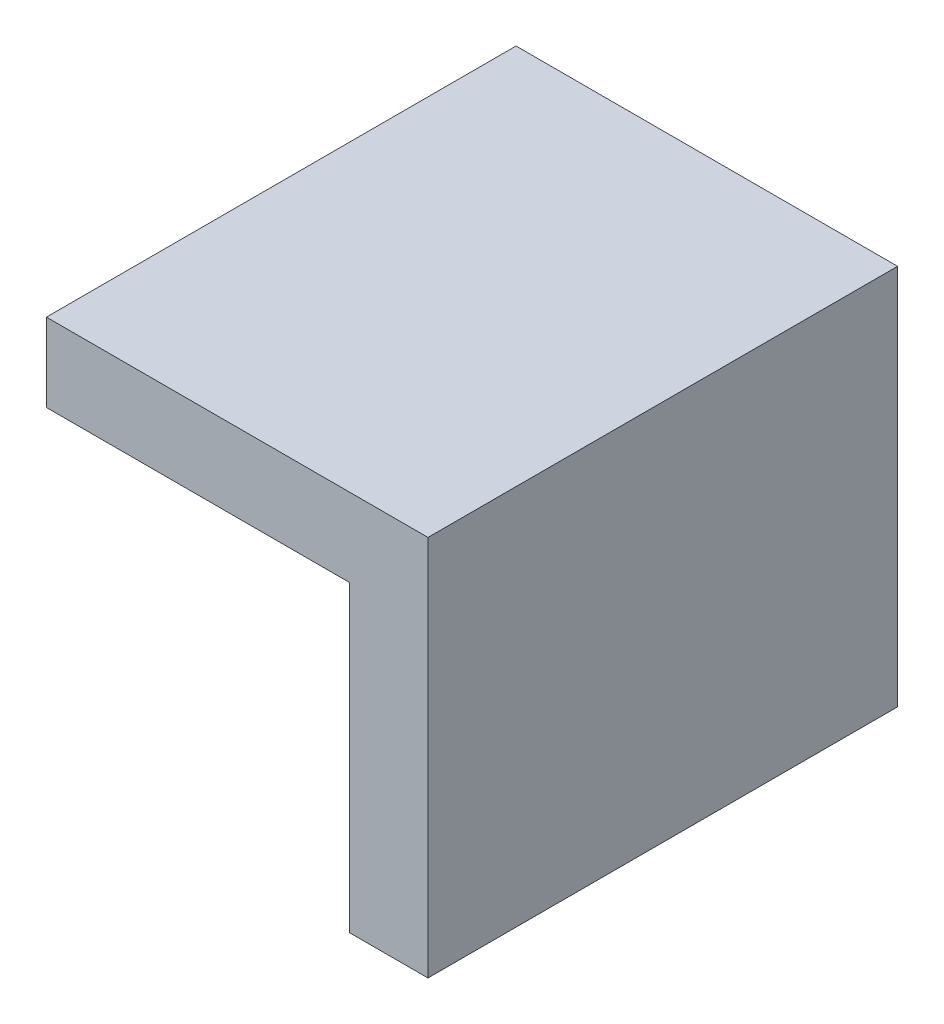
ISO-10303-21;
HEADER;
FILE_DESCRIPTION(('STEP AP214'),'2;1');
FILE_NAME('part.step','',(''),(''),'','','');
FILE_SCHEMA(('AUTOMOTIVE_DESIGN { 1 0 10303 214 1 1 1 1 }'));
ENDSEC;
DATA;
#1=APPLICATION_CONTEXT('core data for automotive mechanical design processes');
#2=APPLICATION_PROTOCOL_DEFINITION('international standard','automotive_design',2000,#1);
#3=PRODUCT_CONTEXT('',#1,'mechanical');
#4=PRODUCT('Part','Part','',(#3));
#5=PRODUCT_RELATED_PRODUCT_CATEGORY('part','',(#4));
#6=PRODUCT_DEFINITION_FORMATION('','',#4);
#7=PRODUCT_DEFINITION_CONTEXT('part definition',#1,'design');
#8=PRODUCT_DEFINITION('design','',#6,#7);
#9=PRODUCT_DEFINITION_SHAPE('','',#8);
#10=(LENGTH_UNIT() NAMED_UNIT(*) SI_UNIT(.MILLI.,.METRE.));
#11=(NAMED_UNIT(*) PLANE_ANGLE_UNIT() SI_UNIT($,.RADIAN.));
#12=(NAMED_UNIT(*) SI_UNIT($,.STERADIAN.) SOLID_ANGLE_UNIT());
#13=UNCERTAINTY_MEASURE_WITH_UNIT(LENGTH_MEASURE(1.E-05),#10,'distance_accuracy_value','');
#14=(GEOMETRIC_REPRESENTATION_CONTEXT(3) GLOBAL_UNCERTAINTY_ASSIGNED_CONTEXT((#13)) GLOBAL_UNIT_ASSIGNED_CONTEXT((#10,
#11,#12)) REPRESENTATION_CONTEXT('',''));
#15=CARTESIAN_POINT('',(0.,0.,0.));
#16=DIRECTION('',(0.,0.,1.));
#17=DIRECTION('',(1.,0.,0.));
#18=AXIS2_PLACEMENT_3D('',#15,#16,#17);
#19=CARTESIAN_POINT('',(3.9,-3.9,9.6));
#20=DIRECTION('',(-1.,0.,0.));
#21=DIRECTION('',(0.,0.,1.));
#22=AXIS2_PLACEMENT_3D('',#19,#20,#21);
#23=PLANE('',#22);
#24=DIRECTION('',(0.,1.,0.));
#25=VECTOR('',#24,1.);
#26=CARTESIAN_POINT('',(3.9,-3.9,0.));
#27=LINE('',#26,#25);
#28=CARTESIAN_POINT('',(3.9,-3.9,0.));
#29=VERTEX_POINT('',#28);
#30=CARTESIAN_POINT('',(3.9,3.9,0.));
#31=VERTEX_POINT('',#30);
#32=EDGE_CURVE('E133',#29,#31,#27,.T.);
#33=ORIENTED_EDGE('',*,*,#32,.T.);
#34=DIRECTION('',(0.,0.,-1.));
#35=VECTOR('',#34,1.);
#36=CARTESIAN_POINT('',(3.9,3.9,9.6));
#37=LINE('',#36,#35);
#38=CARTESIAN_POINT('',(3.9,3.9,9.6));
#39=VERTEX_POINT('',#38);
#40=EDGE_CURVE('E11',#39,#31,#37,.T.);
#41=ORIENTED_EDGE('',*,*,#40,.F.);
#42=DIRECTION('',(0.,1.,0.));
#43=VECTOR('',#42,1.);
#44=CARTESIAN_POINT('',(3.9,-3.9,9.6));
#45=LINE('',#44,#43);
#46=CARTESIAN_POINT('',(3.9,-3.9,9.6));
#47=VERTEX_POINT('',#46);
#48=EDGE_CURVE('E129',#47,#39,#45,.T.);
#49=ORIENTED_EDGE('',*,*,#48,.F.);
#50=DIRECTION('',(0.,0.,-1.));
#51=VECTOR('',#50,1.);
#52=CARTESIAN_POINT('',(3.9,-3.9,9.6));
#53=LINE('',#52,#51);
#54=EDGE_CURVE('E124',#47,#29,#53,.T.);
#55=ORIENTED_EDGE('',*,*,#54,.T.);
#56=EDGE_LOOP('',(#33,#41,#49,#55));
#57=FACE_BOUND('',#56,.T.);
#58=ADVANCED_FACE('F35',(#57),#23,.F.);
#59=CARTESIAN_POINT('',(-3.9,3.9,9.6));
#60=DIRECTION('',(0.,-1.,0.));
#61=DIRECTION('',(0.,0.,-1.));
#62=AXIS2_PLACEMENT_3D('',#59,#60,#61);
#63=PLANE('',#62);
#64=DIRECTION('',(-1.,0.,0.));
#65=VECTOR('',#64,1.);
#66=CARTESIAN_POINT('',(-3.9,3.9,0.));
#67=LINE('',#66,#65);
#68=CARTESIAN_POINT('',(-3.9,3.9,0.));
#69=VERTEX_POINT('',#68);
#70=EDGE_CURVE('E131',#31,#69,#67,.T.);
#71=ORIENTED_EDGE('',*,*,#70,.T.);
#72=DIRECTION('',(0.,0.,-1.));
#73=VECTOR('',#72,1.);
#74=CARTESIAN_POINT('',(-3.9,3.9,9.6));
#75=LINE('',#74,#73);
#76=CARTESIAN_POINT('',(-3.9,3.9,9.6));
#77=VERTEX_POINT('',#76);
#78=EDGE_CURVE('E42',#77,#69,#75,.T.);
#79=ORIENTED_EDGE('',*,*,#78,.F.);
#80=DIRECTION('',(-1.,0.,0.));
#81=VECTOR('',#80,1.);
#82=CARTESIAN_POINT('',(-3.9,3.9,9.6));
#83=LINE('',#82,#81);
#84=EDGE_CURVE('E82',#39,#77,#83,.T.);
#85=ORIENTED_EDGE('',*,*,#84,.F.);
#86=ORIENTED_EDGE('',*,*,#40,.T.);
#87=EDGE_LOOP('',(#71,#79,#85,#86));
#88=FACE_BOUND('',#87,.T.);
#89=ADVANCED_FACE('F179',(#88),#63,.F.);
#90=CARTESIAN_POINT('',(-3.9,-3.9,9.6));
#91=DIRECTION('',(1.,0.,0.));
#92=DIRECTION('',(0.,0.,-1.));
#93=AXIS2_PLACEMENT_3D('',#90,#91,#92);
#94=PLANE('',#93);
#95=DIRECTION('',(0.,-1.,0.));
#96=VECTOR('',#95,1.);
#97=CARTESIAN_POINT('',(-3.9,-3.9,2.));
#98=LINE('',#97,#96);
#99=CARTESIAN_POINT('',(-3.9,2.3,2.));
#100=VERTEX_POINT('',#99);
#101=CARTESIAN_POINT('',(-3.9,-3.9,2.));
#102=VERTEX_POINT('',#101);
#103=EDGE_CURVE('E103',#100,#102,#98,.T.);
#104=ORIENTED_EDGE('',*,*,#103,.F.);
#105=DIRECTION('',(0.,0.,1.));
#106=VECTOR('',#105,1.);
#107=CARTESIAN_POINT('',(-3.9,2.3,2.));
#108=LINE('',#107,#106);
#109=CARTESIAN_POINT('',(-3.9,2.3,9.6));
#110=VERTEX_POINT('',#109);
#111=EDGE_CURVE('E136',#100,#110,#108,.T.);
#112=ORIENTED_EDGE('',*,*,#111,.T.);
#113=DIRECTION('',(0.,-1.,0.));
#114=VECTOR('',#113,1.);
#115=CARTESIAN_POINT('',(-3.9,-3.9,9.6));
#116=LINE('',#115,#114);
#117=EDGE_CURVE('E138',#77,#110,#116,.T.);
#118=ORIENTED_EDGE('',*,*,#117,.F.);
#119=ORIENTED_EDGE('',*,*,#78,.T.);
#120=DIRECTION('',(0.,-1.,0.));
#121=VECTOR('',#120,1.);
#122=CARTESIAN_POINT('',(-3.9,-3.9,0.));
#123=LINE('',#122,#121);
#124=CARTESIAN_POINT('',(-3.9,-3.9,0.));
#125=VERTEX_POINT('',#124);
#126=EDGE_CURVE('E123',#69,#125,#123,.T.);
#127=ORIENTED_EDGE('',*,*,#126,.T.);
#128=DIRECTION('',(0.,0.,-1.));
#129=VECTOR('',#128,1.);
#130=CARTESIAN_POINT('',(-3.9,-3.9,9.6));
#131=LINE('',#130,#129);
#132=EDGE_CURVE('E116',#102,#125,#131,.T.);
#133=ORIENTED_EDGE('',*,*,#132,.F.);
#134=EDGE_LOOP('',(#104,#112,#118,#119,#127,#133));
#135=FACE_BOUND('',#134,.T.);
#136=ADVANCED_FACE('F120',(#135),#94,.F.);
#137=CARTESIAN_POINT('',(-3.9,-3.9,9.6));
#138=DIRECTION('',(0.,1.,0.));
#139=DIRECTION('',(0.,0.,1.));
#140=AXIS2_PLACEMENT_3D('',#137,#138,#139);
#141=PLANE('',#140);
#142=DIRECTION('',(1.,0.,0.));
#143=VECTOR('',#142,1.);
#144=CARTESIAN_POINT('',(-3.9,-3.9,9.6));
#145=LINE('',#144,#143);
#146=CARTESIAN_POINT('',(2.3,-3.9,9.6));
#147=VERTEX_POINT('',#146);
#148=EDGE_CURVE('E57',#147,#47,#145,.T.);
#149=ORIENTED_EDGE('',*,*,#148,.F.);
#150=DIRECTION('',(0.,0.,1.));
#151=VECTOR('',#150,1.);
#152=CARTESIAN_POINT('',(2.3,-3.9,2.));
#153=LINE('',#152,#151);
#154=CARTESIAN_POINT('',(2.3,-3.9,2.));
#155=VERTEX_POINT('',#154);
#156=EDGE_CURVE('E49',#155,#147,#153,.T.);
#157=ORIENTED_EDGE('',*,*,#156,.F.);
#158=DIRECTION('',(1.,0.,0.));
#159=VECTOR('',#158,1.);
#160=CARTESIAN_POINT('',(-3.9,-3.9,2.));
#161=LINE('',#160,#159);
#162=EDGE_CURVE('E107',#102,#155,#161,.T.);
#163=ORIENTED_EDGE('',*,*,#162,.F.);
#164=ORIENTED_EDGE('',*,*,#132,.T.);
#165=DIRECTION('',(1.,0.,0.));
#166=VECTOR('',#165,1.);
#167=CARTESIAN_POINT('',(-3.9,-3.9,0.));
#168=LINE('',#167,#166);
#169=EDGE_CURVE('E77',#125,#29,#168,.T.);
#170=ORIENTED_EDGE('',*,*,#169,.T.);
#171=ORIENTED_EDGE('',*,*,#54,.F.);
#172=EDGE_LOOP('',(#149,#157,#163,#164,#170,#171));
#173=FACE_BOUND('',#172,.T.);
#174=ADVANCED_FACE('F115',(#173),#141,.F.);
#175=CARTESIAN_POINT('',(0.,0.,9.6));
#176=DIRECTION('',(0.,0.,-1.));
#177=DIRECTION('',(-1.,0.,0.));
#178=AXIS2_PLACEMENT_3D('',#175,#176,#177);
#179=PLANE('',#178);
#180=ORIENTED_EDGE('',*,*,#117,.T.);
#181=DIRECTION('',(-1.,0.,0.));
#182=VECTOR('',#181,1.);
#183=CARTESIAN_POINT('',(-3.9,2.3,9.6));
#184=LINE('',#183,#182);
#185=CARTESIAN_POINT('',(2.3,2.3,9.6));
#186=VERTEX_POINT('',#185);
#187=EDGE_CURVE('E113',#186,#110,#184,.T.);
#188=ORIENTED_EDGE('',*,*,#187,.F.);
#189=DIRECTION('',(0.,1.,0.));
#190=VECTOR('',#189,1.);
#191=CARTESIAN_POINT('',(2.3,-3.9,9.6));
#192=LINE('',#191,#190);
#193=EDGE_CURVE('E148',#147,#186,#192,.T.);
#194=ORIENTED_EDGE('',*,*,#193,.F.);
#195=ORIENTED_EDGE('',*,*,#148,.T.);
#196=ORIENTED_EDGE('',*,*,#48,.T.);
#197=ORIENTED_EDGE('',*,*,#84,.T.);
#198=EDGE_LOOP('',(#180,#188,#194,#195,#196,#197));
#199=FACE_BOUND('',#198,.T.);
#200=ADVANCED_FACE('F171',(#199),#179,.F.);
#201=CARTESIAN_POINT('',(0.,0.,0.));
#202=DIRECTION('',(0.,0.,-1.));
#203=DIRECTION('',(-1.,0.,0.));
#204=AXIS2_PLACEMENT_3D('',#201,#202,#203);
#205=PLANE('',#204);
#206=CARTESIAN_POINT('',(0.,0.,0.));
#207=DIRECTION('',(0.,0.,-1.));
#208=DIRECTION('',(-1.,0.,0.));
#209=AXIS2_PLACEMENT_3D('',#206,#207,#208);
#210=CIRCLE('',#209,2.5);
#211=CARTESIAN_POINT('',(-2.5,0.,0.));
#212=VERTEX_POINT('',#211);
#213=EDGE_CURVE('E153',#212,#212,#210,.T.);
#214=ORIENTED_EDGE('',*,*,#213,.F.);
#215=EDGE_LOOP('',(#214));
#216=FACE_BOUND('',#215,.T.);
#217=ORIENTED_EDGE('',*,*,#32,.F.);
#218=ORIENTED_EDGE('',*,*,#169,.F.);
#219=ORIENTED_EDGE('',*,*,#126,.F.);
#220=ORIENTED_EDGE('',*,*,#70,.F.);
#221=EDGE_LOOP('',(#217,#218,#219,#220));
#222=FACE_BOUND('',#221,.T.);
#223=ADVANCED_FACE('F167',(#216,#222),#205,.T.);
#224=CARTESIAN_POINT('',(-3.9,2.3,2.));
#225=DIRECTION('',(0.,1.,0.));
#226=DIRECTION('',(-1.,0.,0.));
#227=AXIS2_PLACEMENT_3D('',#224,#225,#226);
#228=PLANE('',#227);
#229=ORIENTED_EDGE('',*,*,#187,.T.);
#230=ORIENTED_EDGE('',*,*,#111,.F.);
#231=DIRECTION('',(-1.,0.,0.));
#232=VECTOR('',#231,1.);
#233=CARTESIAN_POINT('',(-3.9,2.3,2.));
#234=LINE('',#233,#232);
#235=CARTESIAN_POINT('',(2.3,2.3,2.));
#236=VERTEX_POINT('',#235);
#237=EDGE_CURVE('E109',#236,#100,#234,.T.);
#238=ORIENTED_EDGE('',*,*,#237,.F.);
#239=DIRECTION('',(0.,0.,1.));
#240=VECTOR('',#239,1.);
#241=CARTESIAN_POINT('',(2.3,2.3,2.));
#242=LINE('',#241,#240);
#243=EDGE_CURVE('E144',#236,#186,#242,.T.);
#244=ORIENTED_EDGE('',*,*,#243,.T.);
#245=EDGE_LOOP('',(#229,#230,#238,#244));
#246=FACE_BOUND('',#245,.T.);
#247=ADVANCED_FACE('F170',(#246),#228,.F.);
#248=CARTESIAN_POINT('',(2.3,-3.9,2.));
#249=DIRECTION('',(1.,0.,0.));
#250=DIRECTION('',(0.,0.,-1.));
#251=AXIS2_PLACEMENT_3D('',#248,#249,#250);
#252=PLANE('',#251);
#253=ORIENTED_EDGE('',*,*,#193,.T.);
#254=ORIENTED_EDGE('',*,*,#243,.F.);
#255=DIRECTION('',(0.,1.,0.));
#256=VECTOR('',#255,1.);
#257=CARTESIAN_POINT('',(2.3,-3.9,2.));
#258=LINE('',#257,#256);
#259=EDGE_CURVE('E118',#155,#236,#258,.T.);
#260=ORIENTED_EDGE('',*,*,#259,.F.);
#261=ORIENTED_EDGE('',*,*,#156,.T.);
#262=EDGE_LOOP('',(#253,#254,#260,#261));
#263=FACE_BOUND('',#262,.T.);
#264=ADVANCED_FACE('F181',(#263),#252,.F.);
#265=CARTESIAN_POINT('',(0.,0.,2.));
#266=DIRECTION('',(0.,0.,-1.));
#267=DIRECTION('',(-1.,0.,0.));
#268=AXIS2_PLACEMENT_3D('',#265,#266,#267);
#269=PLANE('',#268);
#270=ORIENTED_EDGE('',*,*,#103,.T.);
#271=ORIENTED_EDGE('',*,*,#162,.T.);
#272=ORIENTED_EDGE('',*,*,#259,.T.);
#273=ORIENTED_EDGE('',*,*,#237,.T.);
#274=EDGE_LOOP('',(#270,#271,#272,#273));
#275=FACE_BOUND('',#274,.T.);
#276=ADVANCED_FACE('F105',(#275),#269,.F.);
#277=CARTESIAN_POINT('',(0.,0.,1.8));
#278=DIRECTION('',(0.,0.,-1.));
#279=DIRECTION('',(-1.,0.,0.));
#280=AXIS2_PLACEMENT_3D('',#277,#278,#279);
#281=CYLINDRICAL_SURFACE('',#280,2.5);
#282=CARTESIAN_POINT('',(0.,0.,1.8));
#283=DIRECTION('',(0.,0.,-1.));
#284=DIRECTION('',(-1.,0.,0.));
#285=AXIS2_PLACEMENT_3D('',#282,#283,#284);
#286=CIRCLE('',#285,2.5);
#287=CARTESIAN_POINT('',(-2.5,0.,1.8));
#288=VERTEX_POINT('',#287);
#289=EDGE_CURVE('E150',#288,#288,#286,.T.);
#290=ORIENTED_EDGE('',*,*,#289,.F.);
#291=EDGE_LOOP('',(#290));
#292=FACE_BOUND('',#291,.T.);
#293=ORIENTED_EDGE('',*,*,#213,.T.);
#294=EDGE_LOOP('',(#293));
#295=FACE_BOUND('',#294,.T.);
#296=ADVANCED_FACE('F161',(#292,#295),#281,.F.);
#297=CARTESIAN_POINT('',(0.,0.,1.8));
#298=DIRECTION('',(0.,0.,-1.));
#299=DIRECTION('',(-1.,0.,0.));
#300=AXIS2_PLACEMENT_3D('',#297,#298,#299);
#301=PLANE('',#300);
#302=ORIENTED_EDGE('',*,*,#289,.T.);
#303=EDGE_LOOP('',(#302));
#304=FACE_BOUND('',#303,.T.);
#305=ADVANCED_FACE('F159',(#304),#301,.T.);
#306=CLOSED_SHELL('',(#58,#89,#136,#174,#200,#223,#247,#264,#276,#296,#305));
#307=MANIFOLD_SOLID_BREP('B2',#306);
#308=ADVANCED_BREP_SHAPE_REPRESENTATION('',(#18,#307),#14);
#309=SHAPE_DEFINITION_REPRESENTATION(#9,#308);
ENDSEC;
END-ISO-10303-21;
